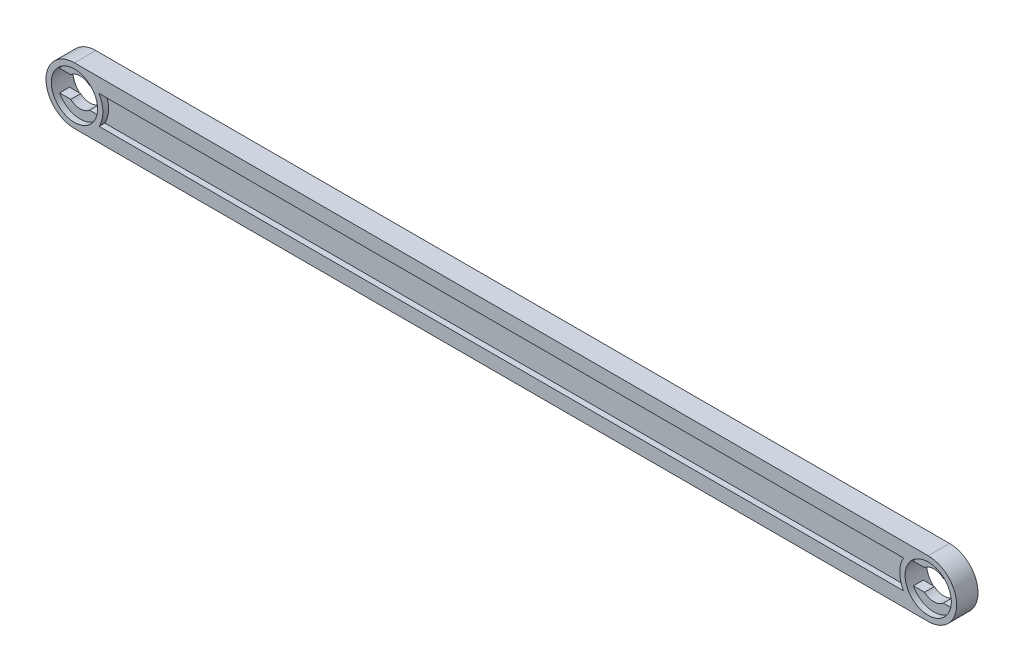
ISO-10303-21;
HEADER;
FILE_DESCRIPTION(('STEP AP214'),'2;1');
FILE_NAME('part.step','',(''),(''),'','','');
FILE_SCHEMA(('AUTOMOTIVE_DESIGN { 1 0 10303 214 1 1 1 1 }'));
ENDSEC;
DATA;
#1=APPLICATION_CONTEXT('core data for automotive mechanical design processes');
#2=APPLICATION_PROTOCOL_DEFINITION('international standard','automotive_design',2000,#1);
#3=PRODUCT_CONTEXT('',#1,'mechanical');
#4=PRODUCT('Part','Part','',(#3));
#5=PRODUCT_RELATED_PRODUCT_CATEGORY('part','',(#4));
#6=PRODUCT_DEFINITION_FORMATION('','',#4);
#7=PRODUCT_DEFINITION_CONTEXT('part definition',#1,'design');
#8=PRODUCT_DEFINITION('design','',#6,#7);
#9=PRODUCT_DEFINITION_SHAPE('','',#8);
#10=(LENGTH_UNIT() NAMED_UNIT(*) SI_UNIT(.MILLI.,.METRE.));
#11=(NAMED_UNIT(*) PLANE_ANGLE_UNIT() SI_UNIT($,.RADIAN.));
#12=(NAMED_UNIT(*) SI_UNIT($,.STERADIAN.) SOLID_ANGLE_UNIT());
#13=UNCERTAINTY_MEASURE_WITH_UNIT(LENGTH_MEASURE(1.E-05),#10,'distance_accuracy_value','');
#14=(GEOMETRIC_REPRESENTATION_CONTEXT(3) GLOBAL_UNCERTAINTY_ASSIGNED_CONTEXT((#13)) GLOBAL_UNIT_ASSIGNED_CONTEXT((#10,
#11,#12)) REPRESENTATION_CONTEXT('',''));
#15=CARTESIAN_POINT('',(0.,0.,0.));
#16=DIRECTION('',(0.,0.,1.));
#17=DIRECTION('',(1.,0.,0.));
#18=AXIS2_PLACEMENT_3D('',#15,#16,#17);
#19=CARTESIAN_POINT('',(0.,0.,0.));
#20=DIRECTION('',(0.,0.,1.));
#21=DIRECTION('',(1.,0.,0.));
#22=AXIS2_PLACEMENT_3D('',#19,#20,#21);
#23=PLANE('',#22);
#24=CARTESIAN_POINT('',(120.,0.,0.));
#25=DIRECTION('',(0.,0.,-1.));
#26=DIRECTION('',(1.,0.,0.));
#27=AXIS2_PLACEMENT_3D('',#24,#25,#26);
#28=CIRCLE('',#27,4.);
#29=CARTESIAN_POINT('',(116.535898384862,-2.,0.));
#30=VERTEX_POINT('',#29);
#31=CARTESIAN_POINT('',(116.535898384862,2.,0.));
#32=VERTEX_POINT('',#31);
#33=EDGE_CURVE('E57',#30,#32,#28,.T.);
#34=ORIENTED_EDGE('',*,*,#33,.F.);
#35=DIRECTION('',(1.,0.,0.));
#36=VECTOR('',#35,1.);
#37=CARTESIAN_POINT('',(3.46410161513775,-2.,0.));
#38=LINE('',#37,#36);
#39=CARTESIAN_POINT('',(3.46410161513775,-2.,0.));
#40=VERTEX_POINT('',#39);
#41=EDGE_CURVE('E261',#40,#30,#38,.T.);
#42=ORIENTED_EDGE('',*,*,#41,.F.);
#43=CARTESIAN_POINT('',(0.,0.,0.));
#44=DIRECTION('',(0.,0.,-1.));
#45=DIRECTION('',(1.,0.,0.));
#46=AXIS2_PLACEMENT_3D('',#43,#44,#45);
#47=CIRCLE('',#46,4.);
#48=CARTESIAN_POINT('',(3.46410161513776,2.,0.));
#49=VERTEX_POINT('',#48);
#50=EDGE_CURVE('E275',#49,#40,#47,.T.);
#51=ORIENTED_EDGE('',*,*,#50,.F.);
#52=DIRECTION('',(-1.,0.,0.));
#53=VECTOR('',#52,1.);
#54=CARTESIAN_POINT('',(3.46410161513775,2.,0.));
#55=LINE('',#54,#53);
#56=EDGE_CURVE('E272',#32,#49,#55,.T.);
#57=ORIENTED_EDGE('',*,*,#56,.F.);
#58=EDGE_LOOP('',(#34,#42,#51,#57));
#59=FACE_BOUND('',#58,.T.);
#60=CARTESIAN_POINT('',(0.,0.,0.));
#61=DIRECTION('',(0.,0.,1.));
#62=DIRECTION('',(1.,0.,0.));
#63=AXIS2_PLACEMENT_3D('',#60,#61,#62);
#64=CIRCLE('',#63,4.);
#65=CARTESIAN_POINT('',(0.,4.,0.));
#66=VERTEX_POINT('',#65);
#67=CARTESIAN_POINT('',(0.,-4.,0.));
#68=VERTEX_POINT('',#67);
#69=EDGE_CURVE('E393',#66,#68,#64,.T.);
#70=ORIENTED_EDGE('',*,*,#69,.T.);
#71=DIRECTION('',(1.,0.,0.));
#72=VECTOR('',#71,1.);
#73=CARTESIAN_POINT('',(0.,-4.,0.));
#74=LINE('',#73,#72);
#75=CARTESIAN_POINT('',(120.,-4.,0.));
#76=VERTEX_POINT('',#75);
#77=EDGE_CURVE('E423',#68,#76,#74,.T.);
#78=ORIENTED_EDGE('',*,*,#77,.T.);
#79=CARTESIAN_POINT('',(120.,0.,0.));
#80=DIRECTION('',(0.,0.,1.));
#81=DIRECTION('',(1.,0.,0.));
#82=AXIS2_PLACEMENT_3D('',#79,#80,#81);
#83=CIRCLE('',#82,4.);
#84=CARTESIAN_POINT('',(120.,4.,0.));
#85=VERTEX_POINT('',#84);
#86=EDGE_CURVE('E426',#76,#85,#83,.T.);
#87=ORIENTED_EDGE('',*,*,#86,.T.);
#88=DIRECTION('',(-1.,0.,0.));
#89=VECTOR('',#88,1.);
#90=CARTESIAN_POINT('',(0.,4.,0.));
#91=LINE('',#90,#89);
#92=EDGE_CURVE('E411',#85,#66,#91,.T.);
#93=ORIENTED_EDGE('',*,*,#92,.T.);
#94=EDGE_LOOP('',(#70,#78,#87,#93));
#95=FACE_BOUND('',#94,.T.);
#96=CARTESIAN_POINT('',(0.,0.,0.));
#97=DIRECTION('',(0.,0.,1.));
#98=DIRECTION('',(1.,0.,0.));
#99=AXIS2_PLACEMENT_3D('',#96,#97,#98);
#100=CIRCLE('',#99,3.25);
#101=CARTESIAN_POINT('',(3.25,0.,0.));
#102=VERTEX_POINT('',#101);
#103=EDGE_CURVE('E387',#102,#102,#100,.T.);
#104=ORIENTED_EDGE('',*,*,#103,.F.);
#105=EDGE_LOOP('',(#104));
#106=FACE_BOUND('',#105,.T.);
#107=CARTESIAN_POINT('',(120.,0.,0.));
#108=DIRECTION('',(0.,0.,-1.));
#109=DIRECTION('',(-1.,0.,0.));
#110=AXIS2_PLACEMENT_3D('',#107,#108,#109);
#111=CIRCLE('',#110,3.25);
#112=CARTESIAN_POINT('',(116.75,0.,0.));
#113=VERTEX_POINT('',#112);
#114=EDGE_CURVE('E324',#113,#113,#111,.T.);
#115=ORIENTED_EDGE('',*,*,#114,.T.);
#116=EDGE_LOOP('',(#115));
#117=FACE_BOUND('',#116,.T.);
#118=ADVANCED_FACE('F34',(#59,#95,#106,#117),#23,.T.);
#119=CARTESIAN_POINT('',(122.883140648668,-1.5,-3.001));
#120=DIRECTION('',(0.,1.,0.));
#121=DIRECTION('',(0.,0.,1.));
#122=AXIS2_PLACEMENT_3D('',#119,#120,#121);
#123=PLANE('',#122);
#124=DIRECTION('',(1.,0.,0.));
#125=VECTOR('',#124,1.);
#126=CARTESIAN_POINT('',(122.883140648668,-1.5,-2.2));
#127=LINE('',#126,#125);
#128=CARTESIAN_POINT('',(121.322875655532,-1.5,-2.2));
#129=VERTEX_POINT('',#128);
#130=CARTESIAN_POINT('',(122.883140648668,-1.5,-2.2));
#131=VERTEX_POINT('',#130);
#132=EDGE_CURVE('E300',#129,#131,#127,.T.);
#133=ORIENTED_EDGE('',*,*,#132,.F.);
#134=DIRECTION('',(0.,0.,1.));
#135=VECTOR('',#134,1.);
#136=CARTESIAN_POINT('',(121.322875655532,-1.5,-3.001));
#137=LINE('',#136,#135);
#138=CARTESIAN_POINT('',(121.322875655532,-1.5,-0.8));
#139=VERTEX_POINT('',#138);
#140=EDGE_CURVE('E331',#129,#139,#137,.T.);
#141=ORIENTED_EDGE('',*,*,#140,.T.);
#142=DIRECTION('',(1.,0.,0.));
#143=VECTOR('',#142,1.);
#144=CARTESIAN_POINT('',(122.883140648668,-1.5,-0.8));
#145=LINE('',#144,#143);
#146=CARTESIAN_POINT('',(122.883140648668,-1.5,-0.8));
#147=VERTEX_POINT('',#146);
#148=EDGE_CURVE('E318',#139,#147,#145,.T.);
#149=ORIENTED_EDGE('',*,*,#148,.T.);
#150=DIRECTION('',(0.,0.,1.));
#151=VECTOR('',#150,1.);
#152=CARTESIAN_POINT('',(122.883140648668,-1.5,-3.001));
#153=LINE('',#152,#151);
#154=EDGE_CURVE('E328',#131,#147,#153,.T.);
#155=ORIENTED_EDGE('',*,*,#154,.F.);
#156=EDGE_LOOP('',(#133,#141,#149,#155));
#157=FACE_BOUND('',#156,.T.);
#158=ADVANCED_FACE('F476',(#157),#123,.T.);
#159=CARTESIAN_POINT('',(120.,0.,-3.001));
#160=DIRECTION('',(0.,0.,1.));
#161=DIRECTION('',(1.,0.,0.));
#162=AXIS2_PLACEMENT_3D('',#159,#160,#161);
#163=CYLINDRICAL_SURFACE('',#162,2.);
#164=CARTESIAN_POINT('',(120.,0.,-2.2));
#165=DIRECTION('',(0.,0.,1.));
#166=DIRECTION('',(1.,0.,0.));
#167=AXIS2_PLACEMENT_3D('',#164,#165,#166);
#168=CIRCLE('',#167,2.);
#169=CARTESIAN_POINT('',(118.677124344468,-1.5,-2.2));
#170=VERTEX_POINT('',#169);
#171=EDGE_CURVE('E298',#170,#129,#168,.T.);
#172=ORIENTED_EDGE('',*,*,#171,.F.);
#173=DIRECTION('',(0.,0.,1.));
#174=VECTOR('',#173,1.);
#175=CARTESIAN_POINT('',(118.677124344468,-1.5,-3.001));
#176=LINE('',#175,#174);
#177=CARTESIAN_POINT('',(118.677124344468,-1.5,-0.800000000000001));
#178=VERTEX_POINT('',#177);
#179=EDGE_CURVE('E333',#170,#178,#176,.T.);
#180=ORIENTED_EDGE('',*,*,#179,.T.);
#181=CARTESIAN_POINT('',(120.,0.,-0.8));
#182=DIRECTION('',(0.,0.,1.));
#183=DIRECTION('',(1.,0.,0.));
#184=AXIS2_PLACEMENT_3D('',#181,#182,#183);
#185=CIRCLE('',#184,2.);
#186=EDGE_CURVE('E315',#178,#139,#185,.T.);
#187=ORIENTED_EDGE('',*,*,#186,.T.);
#188=ORIENTED_EDGE('',*,*,#140,.F.);
#189=EDGE_LOOP('',(#172,#180,#187,#188));
#190=FACE_BOUND('',#189,.T.);
#191=ADVANCED_FACE('F482',(#190),#163,.F.);
#192=CARTESIAN_POINT('',(118.677124344468,-1.5,-3.001));
#193=DIRECTION('',(0.,1.,0.));
#194=DIRECTION('',(0.,0.,1.));
#195=AXIS2_PLACEMENT_3D('',#192,#193,#194);
#196=PLANE('',#195);
#197=DIRECTION('',(1.,0.,0.));
#198=VECTOR('',#197,1.);
#199=CARTESIAN_POINT('',(118.677124344468,-1.5,-2.2));
#200=LINE('',#199,#198);
#201=CARTESIAN_POINT('',(117.116859351332,-1.5,-2.2));
#202=VERTEX_POINT('',#201);
#203=EDGE_CURVE('E296',#202,#170,#200,.T.);
#204=ORIENTED_EDGE('',*,*,#203,.F.);
#205=DIRECTION('',(0.,0.,1.));
#206=VECTOR('',#205,1.);
#207=CARTESIAN_POINT('',(117.116859351332,-1.5,-3.001));
#208=LINE('',#207,#206);
#209=CARTESIAN_POINT('',(117.116859351332,-1.5,-0.8));
#210=VERTEX_POINT('',#209);
#211=EDGE_CURVE('E335',#202,#210,#208,.T.);
#212=ORIENTED_EDGE('',*,*,#211,.T.);
#213=DIRECTION('',(1.,0.,0.));
#214=VECTOR('',#213,1.);
#215=CARTESIAN_POINT('',(118.677124344468,-1.5,-0.8));
#216=LINE('',#215,#214);
#217=EDGE_CURVE('E312',#210,#178,#216,.T.);
#218=ORIENTED_EDGE('',*,*,#217,.T.);
#219=ORIENTED_EDGE('',*,*,#179,.F.);
#220=EDGE_LOOP('',(#204,#212,#218,#219));
#221=FACE_BOUND('',#220,.T.);
#222=ADVANCED_FACE('F586',(#221),#196,.T.);
#223=CARTESIAN_POINT('',(118.677124344468,1.5,-3.001));
#224=DIRECTION('',(0.,-1.,0.));
#225=DIRECTION('',(0.,0.,-1.));
#226=AXIS2_PLACEMENT_3D('',#223,#224,#225);
#227=PLANE('',#226);
#228=DIRECTION('',(-1.,0.,0.));
#229=VECTOR('',#228,1.);
#230=CARTESIAN_POINT('',(118.677124344468,1.5,-2.2));
#231=LINE('',#230,#229);
#232=CARTESIAN_POINT('',(118.677124344468,1.5,-2.2));
#233=VERTEX_POINT('',#232);
#234=CARTESIAN_POINT('',(117.116859351332,1.5,-2.2));
#235=VERTEX_POINT('',#234);
#236=EDGE_CURVE('E294',#233,#235,#231,.T.);
#237=ORIENTED_EDGE('',*,*,#236,.F.);
#238=DIRECTION('',(0.,0.,1.));
#239=VECTOR('',#238,1.);
#240=CARTESIAN_POINT('',(118.677124344468,1.5,-3.001));
#241=LINE('',#240,#239);
#242=CARTESIAN_POINT('',(118.677124344468,1.5,-0.8));
#243=VERTEX_POINT('',#242);
#244=EDGE_CURVE('E339',#233,#243,#241,.T.);
#245=ORIENTED_EDGE('',*,*,#244,.T.);
#246=DIRECTION('',(-1.,0.,0.));
#247=VECTOR('',#246,1.);
#248=CARTESIAN_POINT('',(118.677124344468,1.5,-0.8));
#249=LINE('',#248,#247);
#250=CARTESIAN_POINT('',(117.116859351332,1.5,-0.8));
#251=VERTEX_POINT('',#250);
#252=EDGE_CURVE('E309',#243,#251,#249,.T.);
#253=ORIENTED_EDGE('',*,*,#252,.T.);
#254=DIRECTION('',(0.,0.,1.));
#255=VECTOR('',#254,1.);
#256=CARTESIAN_POINT('',(117.116859351332,1.5,-3.001));
#257=LINE('',#256,#255);
#258=EDGE_CURVE('E337',#235,#251,#257,.T.);
#259=ORIENTED_EDGE('',*,*,#258,.F.);
#260=EDGE_LOOP('',(#237,#245,#253,#259));
#261=FACE_BOUND('',#260,.T.);
#262=ADVANCED_FACE('F590',(#261),#227,.T.);
#263=CARTESIAN_POINT('',(120.,0.,-3.001));
#264=DIRECTION('',(0.,0.,1.));
#265=DIRECTION('',(1.,0.,0.));
#266=AXIS2_PLACEMENT_3D('',#263,#264,#265);
#267=CYLINDRICAL_SURFACE('',#266,2.);
#268=CARTESIAN_POINT('',(120.,0.,-2.2));
#269=DIRECTION('',(0.,0.,1.));
#270=DIRECTION('',(1.,0.,0.));
#271=AXIS2_PLACEMENT_3D('',#268,#269,#270);
#272=CIRCLE('',#271,2.);
#273=CARTESIAN_POINT('',(121.322875655532,1.5,-2.2));
#274=VERTEX_POINT('',#273);
#275=EDGE_CURVE('E292',#274,#233,#272,.T.);
#276=ORIENTED_EDGE('',*,*,#275,.F.);
#277=DIRECTION('',(0.,0.,1.));
#278=VECTOR('',#277,1.);
#279=CARTESIAN_POINT('',(121.322875655532,1.5,-3.001));
#280=LINE('',#279,#278);
#281=CARTESIAN_POINT('',(121.322875655532,1.5,-0.800000000000001));
#282=VERTEX_POINT('',#281);
#283=EDGE_CURVE('E341',#274,#282,#280,.T.);
#284=ORIENTED_EDGE('',*,*,#283,.T.);
#285=CARTESIAN_POINT('',(120.,0.,-0.8));
#286=DIRECTION('',(0.,0.,1.));
#287=DIRECTION('',(1.,0.,0.));
#288=AXIS2_PLACEMENT_3D('',#285,#286,#287);
#289=CIRCLE('',#288,2.);
#290=EDGE_CURVE('E306',#282,#243,#289,.T.);
#291=ORIENTED_EDGE('',*,*,#290,.T.);
#292=ORIENTED_EDGE('',*,*,#244,.F.);
#293=EDGE_LOOP('',(#276,#284,#291,#292));
#294=FACE_BOUND('',#293,.T.);
#295=ADVANCED_FACE('F532',(#294),#267,.F.);
#296=CARTESIAN_POINT('',(122.883140648668,1.5,-3.001));
#297=DIRECTION('',(0.,-1.,0.));
#298=DIRECTION('',(0.,0.,-1.));
#299=AXIS2_PLACEMENT_3D('',#296,#297,#298);
#300=PLANE('',#299);
#301=DIRECTION('',(-1.,0.,0.));
#302=VECTOR('',#301,1.);
#303=CARTESIAN_POINT('',(122.883140648668,1.5,-2.2));
#304=LINE('',#303,#302);
#305=CARTESIAN_POINT('',(122.883140648668,1.5,-2.2));
#306=VERTEX_POINT('',#305);
#307=EDGE_CURVE('E290',#306,#274,#304,.T.);
#308=ORIENTED_EDGE('',*,*,#307,.F.);
#309=DIRECTION('',(0.,0.,1.));
#310=VECTOR('',#309,1.);
#311=CARTESIAN_POINT('',(122.883140648668,1.5,-3.001));
#312=LINE('',#311,#310);
#313=CARTESIAN_POINT('',(122.883140648668,1.5,-0.8));
#314=VERTEX_POINT('',#313);
#315=EDGE_CURVE('E327',#306,#314,#312,.T.);
#316=ORIENTED_EDGE('',*,*,#315,.T.);
#317=DIRECTION('',(-1.,0.,0.));
#318=VECTOR('',#317,1.);
#319=CARTESIAN_POINT('',(122.883140648668,1.5,-0.8));
#320=LINE('',#319,#318);
#321=EDGE_CURVE('E11',#314,#282,#320,.T.);
#322=ORIENTED_EDGE('',*,*,#321,.T.);
#323=ORIENTED_EDGE('',*,*,#283,.F.);
#324=EDGE_LOOP('',(#308,#316,#322,#323));
#325=FACE_BOUND('',#324,.T.);
#326=ADVANCED_FACE('F518',(#325),#300,.T.);
#327=CARTESIAN_POINT('',(0.,0.,-3.));
#328=DIRECTION('',(0.,0.,1.));
#329=DIRECTION('',(1.,0.,0.));
#330=AXIS2_PLACEMENT_3D('',#327,#328,#329);
#331=PLANE('',#330);
#332=DIRECTION('',(-1.,0.,0.));
#333=VECTOR('',#332,1.);
#334=CARTESIAN_POINT('',(116.,-2.,-3.));
#335=LINE('',#334,#333);
#336=CARTESIAN_POINT('',(116.,-2.,-3.));
#337=VERTEX_POINT('',#336);
#338=CARTESIAN_POINT('',(4.,-2.,-3.));
#339=VERTEX_POINT('',#338);
#340=EDGE_CURVE('E248',#337,#339,#335,.T.);
#341=ORIENTED_EDGE('',*,*,#340,.F.);
#342=DIRECTION('',(0.,-1.,0.));
#343=VECTOR('',#342,1.);
#344=CARTESIAN_POINT('',(116.,-2.,-3.));
#345=LINE('',#344,#343);
#346=CARTESIAN_POINT('',(116.,2.,-3.));
#347=VERTEX_POINT('',#346);
#348=EDGE_CURVE('E49',#347,#337,#345,.T.);
#349=ORIENTED_EDGE('',*,*,#348,.F.);
#350=DIRECTION('',(1.,0.,0.));
#351=VECTOR('',#350,1.);
#352=CARTESIAN_POINT('',(116.,2.,-3.));
#353=LINE('',#352,#351);
#354=CARTESIAN_POINT('',(4.,2.,-3.));
#355=VERTEX_POINT('',#354);
#356=EDGE_CURVE('E239',#355,#347,#353,.T.);
#357=ORIENTED_EDGE('',*,*,#356,.F.);
#358=DIRECTION('',(0.,1.,0.));
#359=VECTOR('',#358,1.);
#360=CARTESIAN_POINT('',(4.,-2.,-3.));
#361=LINE('',#360,#359);
#362=EDGE_CURVE('E242',#339,#355,#361,.T.);
#363=ORIENTED_EDGE('',*,*,#362,.F.);
#364=EDGE_LOOP('',(#341,#349,#357,#363));
#365=FACE_BOUND('',#364,.T.);
#366=CARTESIAN_POINT('',(0.,0.,-3.));
#367=DIRECTION('',(0.,0.,1.));
#368=DIRECTION('',(1.,0.,0.));
#369=AXIS2_PLACEMENT_3D('',#366,#367,#368);
#370=CIRCLE('',#369,3.25);
#371=CARTESIAN_POINT('',(3.25,0.,-3.));
#372=VERTEX_POINT('',#371);
#373=EDGE_CURVE('E384',#372,#372,#370,.F.);
#374=ORIENTED_EDGE('',*,*,#373,.F.);
#375=EDGE_LOOP('',(#374));
#376=FACE_BOUND('',#375,.T.);
#377=CARTESIAN_POINT('',(0.,0.,-3.));
#378=DIRECTION('',(0.,0.,1.));
#379=DIRECTION('',(1.,0.,0.));
#380=AXIS2_PLACEMENT_3D('',#377,#378,#379);
#381=CIRCLE('',#380,4.);
#382=CARTESIAN_POINT('',(0.,4.,-3.));
#383=VERTEX_POINT('',#382);
#384=CARTESIAN_POINT('',(0.,-4.,-3.));
#385=VERTEX_POINT('',#384);
#386=EDGE_CURVE('E407',#383,#385,#381,.T.);
#387=ORIENTED_EDGE('',*,*,#386,.F.);
#388=DIRECTION('',(-1.,0.,0.));
#389=VECTOR('',#388,1.);
#390=CARTESIAN_POINT('',(0.,4.,-3.));
#391=LINE('',#390,#389);
#392=CARTESIAN_POINT('',(120.,4.,-3.));
#393=VERTEX_POINT('',#392);
#394=EDGE_CURVE('E417',#393,#383,#391,.T.);
#395=ORIENTED_EDGE('',*,*,#394,.F.);
#396=CARTESIAN_POINT('',(120.,0.,-3.));
#397=DIRECTION('',(0.,0.,1.));
#398=DIRECTION('',(1.,0.,0.));
#399=AXIS2_PLACEMENT_3D('',#396,#397,#398);
#400=CIRCLE('',#399,4.);
#401=CARTESIAN_POINT('',(120.,-4.,-3.));
#402=VERTEX_POINT('',#401);
#403=EDGE_CURVE('E414',#402,#393,#400,.T.);
#404=ORIENTED_EDGE('',*,*,#403,.F.);
#405=DIRECTION('',(1.,0.,0.));
#406=VECTOR('',#405,1.);
#407=CARTESIAN_POINT('',(0.,-4.,-3.));
#408=LINE('',#407,#406);
#409=EDGE_CURVE('E410',#385,#402,#408,.T.);
#410=ORIENTED_EDGE('',*,*,#409,.F.);
#411=EDGE_LOOP('',(#387,#395,#404,#410));
#412=FACE_BOUND('',#411,.T.);
#413=CARTESIAN_POINT('',(120.,0.,-3.));
#414=DIRECTION('',(0.,0.,1.));
#415=DIRECTION('',(1.,0.,0.));
#416=AXIS2_PLACEMENT_3D('',#413,#414,#415);
#417=CIRCLE('',#416,3.25);
#418=CARTESIAN_POINT('',(123.25,0.,-3.));
#419=VERTEX_POINT('',#418);
#420=EDGE_CURVE('E321',#419,#419,#417,.T.);
#421=ORIENTED_EDGE('',*,*,#420,.T.);
#422=EDGE_LOOP('',(#421));
#423=FACE_BOUND('',#422,.T.);
#424=ADVANCED_FACE('F488',(#365,#376,#412,#423),#331,.F.);
#425=CARTESIAN_POINT('',(-2.8831406486677,1.5,-3.001));
#426=DIRECTION('',(0.,1.,0.));
#427=DIRECTION('',(0.,0.,1.));
#428=AXIS2_PLACEMENT_3D('',#425,#426,#427);
#429=PLANE('',#428);
#430=DIRECTION('',(0.,0.,1.));
#431=VECTOR('',#430,1.);
#432=CARTESIAN_POINT('',(-2.8831406486677,1.5,-3.001));
#433=LINE('',#432,#431);
#434=CARTESIAN_POINT('',(-2.8831406486677,1.5,-2.2));
#435=VERTEX_POINT('',#434);
#436=CARTESIAN_POINT('',(-2.8831406486677,1.5,-0.8));
#437=VERTEX_POINT('',#436);
#438=EDGE_CURVE('E391',#435,#437,#433,.T.);
#439=ORIENTED_EDGE('',*,*,#438,.F.);
#440=DIRECTION('',(1.,0.,0.));
#441=VECTOR('',#440,1.);
#442=CARTESIAN_POINT('',(-2.8831406486677,1.5,-2.2));
#443=LINE('',#442,#441);
#444=CARTESIAN_POINT('',(-1.3228756555323,1.5,-2.2));
#445=VERTEX_POINT('',#444);
#446=EDGE_CURVE('E362',#435,#445,#443,.T.);
#447=ORIENTED_EDGE('',*,*,#446,.T.);
#448=DIRECTION('',(0.,0.,1.));
#449=VECTOR('',#448,1.);
#450=CARTESIAN_POINT('',(-1.3228756555323,1.5,-3.001));
#451=LINE('',#450,#449);
#452=CARTESIAN_POINT('',(-1.3228756555323,1.5,-0.8));
#453=VERTEX_POINT('',#452);
#454=EDGE_CURVE('E394',#445,#453,#451,.T.);
#455=ORIENTED_EDGE('',*,*,#454,.T.);
#456=DIRECTION('',(1.,0.,0.));
#457=VECTOR('',#456,1.);
#458=CARTESIAN_POINT('',(-2.8831406486677,1.5,-0.8));
#459=LINE('',#458,#457);
#460=EDGE_CURVE('E381',#437,#453,#459,.T.);
#461=ORIENTED_EDGE('',*,*,#460,.F.);
#462=EDGE_LOOP('',(#439,#447,#455,#461));
#463=FACE_BOUND('',#462,.T.);
#464=ADVANCED_FACE('F517',(#463),#429,.F.);
#465=CARTESIAN_POINT('',(0.,0.,-3.001));
#466=DIRECTION('',(0.,0.,1.));
#467=DIRECTION('',(1.,0.,0.));
#468=AXIS2_PLACEMENT_3D('',#465,#466,#467);
#469=CYLINDRICAL_SURFACE('',#468,2.);
#470=ORIENTED_EDGE('',*,*,#454,.F.);
#471=CARTESIAN_POINT('',(0.,0.,-2.2));
#472=DIRECTION('',(0.,0.,1.));
#473=DIRECTION('',(1.,0.,0.));
#474=AXIS2_PLACEMENT_3D('',#471,#472,#473);
#475=CIRCLE('',#474,2.);
#476=CARTESIAN_POINT('',(1.3228756555323,1.5,-2.2));
#477=VERTEX_POINT('',#476);
#478=EDGE_CURVE('E359',#445,#477,#475,.F.);
#479=ORIENTED_EDGE('',*,*,#478,.T.);
#480=DIRECTION('',(0.,0.,1.));
#481=VECTOR('',#480,1.);
#482=CARTESIAN_POINT('',(1.3228756555323,1.5,-3.001));
#483=LINE('',#482,#481);
#484=CARTESIAN_POINT('',(1.3228756555323,1.5,-0.800000000000001));
#485=VERTEX_POINT('',#484);
#486=EDGE_CURVE('E396',#477,#485,#483,.T.);
#487=ORIENTED_EDGE('',*,*,#486,.T.);
#488=CARTESIAN_POINT('',(0.,0.,-0.8));
#489=DIRECTION('',(0.,0.,1.));
#490=DIRECTION('',(1.,0.,0.));
#491=AXIS2_PLACEMENT_3D('',#488,#489,#490);
#492=CIRCLE('',#491,2.);
#493=EDGE_CURVE('E378',#453,#485,#492,.F.);
#494=ORIENTED_EDGE('',*,*,#493,.F.);
#495=EDGE_LOOP('',(#470,#479,#487,#494));
#496=FACE_BOUND('',#495,.T.);
#497=ADVANCED_FACE('F529',(#496),#469,.F.);
#498=CARTESIAN_POINT('',(1.3228756555323,1.5,-3.001));
#499=DIRECTION('',(0.,1.,0.));
#500=DIRECTION('',(0.,0.,1.));
#501=AXIS2_PLACEMENT_3D('',#498,#499,#500);
#502=PLANE('',#501);
#503=ORIENTED_EDGE('',*,*,#486,.F.);
#504=DIRECTION('',(1.,0.,0.));
#505=VECTOR('',#504,1.);
#506=CARTESIAN_POINT('',(1.3228756555323,1.5,-2.2));
#507=LINE('',#506,#505);
#508=CARTESIAN_POINT('',(2.8831406486677,1.5,-2.2));
#509=VERTEX_POINT('',#508);
#510=EDGE_CURVE('E356',#477,#509,#507,.T.);
#511=ORIENTED_EDGE('',*,*,#510,.T.);
#512=DIRECTION('',(0.,0.,1.));
#513=VECTOR('',#512,1.);
#514=CARTESIAN_POINT('',(2.8831406486677,1.5,-3.001));
#515=LINE('',#514,#513);
#516=CARTESIAN_POINT('',(2.8831406486677,1.5,-0.8));
#517=VERTEX_POINT('',#516);
#518=EDGE_CURVE('E398',#509,#517,#515,.T.);
#519=ORIENTED_EDGE('',*,*,#518,.T.);
#520=DIRECTION('',(1.,0.,0.));
#521=VECTOR('',#520,1.);
#522=CARTESIAN_POINT('',(1.3228756555323,1.5,-0.8));
#523=LINE('',#522,#521);
#524=EDGE_CURVE('E375',#485,#517,#523,.T.);
#525=ORIENTED_EDGE('',*,*,#524,.F.);
#526=EDGE_LOOP('',(#503,#511,#519,#525));
#527=FACE_BOUND('',#526,.T.);
#528=ADVANCED_FACE('F807',(#527),#502,.F.);
#529=CARTESIAN_POINT('',(1.3228756555323,-1.5,-3.001));
#530=DIRECTION('',(0.,-1.,0.));
#531=DIRECTION('',(0.,0.,-1.));
#532=AXIS2_PLACEMENT_3D('',#529,#530,#531);
#533=PLANE('',#532);
#534=DIRECTION('',(0.,0.,1.));
#535=VECTOR('',#534,1.);
#536=CARTESIAN_POINT('',(2.8831406486677,-1.5,-3.001));
#537=LINE('',#536,#535);
#538=CARTESIAN_POINT('',(2.8831406486677,-1.5,-2.2));
#539=VERTEX_POINT('',#538);
#540=CARTESIAN_POINT('',(2.8831406486677,-1.5,-0.8));
#541=VERTEX_POINT('',#540);
#542=EDGE_CURVE('E400',#539,#541,#537,.T.);
#543=ORIENTED_EDGE('',*,*,#542,.F.);
#544=DIRECTION('',(-1.,0.,0.));
#545=VECTOR('',#544,1.);
#546=CARTESIAN_POINT('',(1.3228756555323,-1.5,-2.2));
#547=LINE('',#546,#545);
#548=CARTESIAN_POINT('',(1.32287565553229,-1.5,-2.2));
#549=VERTEX_POINT('',#548);
#550=EDGE_CURVE('E353',#539,#549,#547,.T.);
#551=ORIENTED_EDGE('',*,*,#550,.T.);
#552=DIRECTION('',(0.,0.,1.));
#553=VECTOR('',#552,1.);
#554=CARTESIAN_POINT('',(1.32287565553229,-1.5,-3.001));
#555=LINE('',#554,#553);
#556=CARTESIAN_POINT('',(1.32287565553229,-1.5,-0.8));
#557=VERTEX_POINT('',#556);
#558=EDGE_CURVE('E402',#549,#557,#555,.T.);
#559=ORIENTED_EDGE('',*,*,#558,.T.);
#560=DIRECTION('',(-1.,0.,0.));
#561=VECTOR('',#560,1.);
#562=CARTESIAN_POINT('',(1.3228756555323,-1.5,-0.8));
#563=LINE('',#562,#561);
#564=EDGE_CURVE('E372',#541,#557,#563,.T.);
#565=ORIENTED_EDGE('',*,*,#564,.F.);
#566=EDGE_LOOP('',(#543,#551,#559,#565));
#567=FACE_BOUND('',#566,.T.);
#568=ADVANCED_FACE('F454',(#567),#533,.F.);
#569=CARTESIAN_POINT('',(0.,0.,-3.001));
#570=DIRECTION('',(0.,0.,1.));
#571=DIRECTION('',(1.,0.,0.));
#572=AXIS2_PLACEMENT_3D('',#569,#570,#571);
#573=CYLINDRICAL_SURFACE('',#572,2.);
#574=ORIENTED_EDGE('',*,*,#558,.F.);
#575=CARTESIAN_POINT('',(0.,0.,-2.2));
#576=DIRECTION('',(0.,0.,1.));
#577=DIRECTION('',(1.,0.,0.));
#578=AXIS2_PLACEMENT_3D('',#575,#576,#577);
#579=CIRCLE('',#578,2.);
#580=CARTESIAN_POINT('',(-1.3228756555323,-1.5,-2.2));
#581=VERTEX_POINT('',#580);
#582=EDGE_CURVE('E350',#549,#581,#579,.F.);
#583=ORIENTED_EDGE('',*,*,#582,.T.);
#584=DIRECTION('',(0.,0.,1.));
#585=VECTOR('',#584,1.);
#586=CARTESIAN_POINT('',(-1.3228756555323,-1.5,-3.001));
#587=LINE('',#586,#585);
#588=CARTESIAN_POINT('',(-1.3228756555323,-1.5,-0.800000000000001));
#589=VERTEX_POINT('',#588);
#590=EDGE_CURVE('E404',#581,#589,#587,.T.);
#591=ORIENTED_EDGE('',*,*,#590,.T.);
#592=CARTESIAN_POINT('',(0.,0.,-0.8));
#593=DIRECTION('',(0.,0.,1.));
#594=DIRECTION('',(1.,0.,0.));
#595=AXIS2_PLACEMENT_3D('',#592,#593,#594);
#596=CIRCLE('',#595,2.);
#597=EDGE_CURVE('E369',#557,#589,#596,.F.);
#598=ORIENTED_EDGE('',*,*,#597,.F.);
#599=EDGE_LOOP('',(#574,#583,#591,#598));
#600=FACE_BOUND('',#599,.T.);
#601=ADVANCED_FACE('F457',(#600),#573,.F.);
#602=CARTESIAN_POINT('',(-2.8831406486677,-1.5,-3.001));
#603=DIRECTION('',(0.,-1.,0.));
#604=DIRECTION('',(0.,0.,-1.));
#605=AXIS2_PLACEMENT_3D('',#602,#603,#604);
#606=PLANE('',#605);
#607=ORIENTED_EDGE('',*,*,#590,.F.);
#608=DIRECTION('',(-1.,0.,0.));
#609=VECTOR('',#608,1.);
#610=CARTESIAN_POINT('',(-2.8831406486677,-1.5,-2.2));
#611=LINE('',#610,#609);
#612=CARTESIAN_POINT('',(-2.8831406486677,-1.5,-2.2));
#613=VERTEX_POINT('',#612);
#614=EDGE_CURVE('E347',#581,#613,#611,.T.);
#615=ORIENTED_EDGE('',*,*,#614,.T.);
#616=DIRECTION('',(0.,0.,1.));
#617=VECTOR('',#616,1.);
#618=CARTESIAN_POINT('',(-2.8831406486677,-1.5,-3.001));
#619=LINE('',#618,#617);
#620=CARTESIAN_POINT('',(-2.8831406486677,-1.5,-0.8));
#621=VERTEX_POINT('',#620);
#622=EDGE_CURVE('E390',#613,#621,#619,.T.);
#623=ORIENTED_EDGE('',*,*,#622,.T.);
#624=DIRECTION('',(-1.,0.,0.));
#625=VECTOR('',#624,1.);
#626=CARTESIAN_POINT('',(-2.8831406486677,-1.5,-0.8));
#627=LINE('',#626,#625);
#628=EDGE_CURVE('E42',#589,#621,#627,.T.);
#629=ORIENTED_EDGE('',*,*,#628,.F.);
#630=EDGE_LOOP('',(#607,#615,#623,#629));
#631=FACE_BOUND('',#630,.T.);
#632=ADVANCED_FACE('F458',(#631),#606,.F.);
#633=CARTESIAN_POINT('',(0.,0.,-3.));
#634=DIRECTION('',(0.,0.,1.));
#635=DIRECTION('',(1.,0.,0.));
#636=AXIS2_PLACEMENT_3D('',#633,#634,#635);
#637=CYLINDRICAL_SURFACE('',#636,4.);
#638=ORIENTED_EDGE('',*,*,#69,.F.);
#639=DIRECTION('',(0.,0.,1.));
#640=VECTOR('',#639,1.);
#641=CARTESIAN_POINT('',(0.,4.,-3.));
#642=LINE('',#641,#640);
#643=EDGE_CURVE('E431',#383,#66,#642,.T.);
#644=ORIENTED_EDGE('',*,*,#643,.F.);
#645=ORIENTED_EDGE('',*,*,#386,.T.);
#646=DIRECTION('',(0.,0.,1.));
#647=VECTOR('',#646,1.);
#648=CARTESIAN_POINT('',(0.,-4.,-3.));
#649=LINE('',#648,#647);
#650=EDGE_CURVE('E420',#385,#68,#649,.T.);
#651=ORIENTED_EDGE('',*,*,#650,.T.);
#652=EDGE_LOOP('',(#638,#644,#645,#651));
#653=FACE_BOUND('',#652,.T.);
#654=ADVANCED_FACE('F36',(#653),#637,.T.);
#655=CARTESIAN_POINT('',(0.,4.,-3.));
#656=DIRECTION('',(0.,1.,0.));
#657=DIRECTION('',(0.,0.,1.));
#658=AXIS2_PLACEMENT_3D('',#655,#656,#657);
#659=PLANE('',#658);
#660=ORIENTED_EDGE('',*,*,#92,.F.);
#661=DIRECTION('',(0.,0.,1.));
#662=VECTOR('',#661,1.);
#663=CARTESIAN_POINT('',(120.,4.,-3.));
#664=LINE('',#663,#662);
#665=EDGE_CURVE('E433',#393,#85,#664,.T.);
#666=ORIENTED_EDGE('',*,*,#665,.F.);
#667=ORIENTED_EDGE('',*,*,#394,.T.);
#668=ORIENTED_EDGE('',*,*,#643,.T.);
#669=EDGE_LOOP('',(#660,#666,#667,#668));
#670=FACE_BOUND('',#669,.T.);
#671=ADVANCED_FACE('F490',(#670),#659,.T.);
#672=CARTESIAN_POINT('',(120.,0.,-3.));
#673=DIRECTION('',(0.,0.,1.));
#674=DIRECTION('',(1.,0.,0.));
#675=AXIS2_PLACEMENT_3D('',#672,#673,#674);
#676=CYLINDRICAL_SURFACE('',#675,4.);
#677=ORIENTED_EDGE('',*,*,#86,.F.);
#678=DIRECTION('',(0.,0.,1.));
#679=VECTOR('',#678,1.);
#680=CARTESIAN_POINT('',(120.,-4.,-3.));
#681=LINE('',#680,#679);
#682=EDGE_CURVE('E435',#402,#76,#681,.T.);
#683=ORIENTED_EDGE('',*,*,#682,.F.);
#684=ORIENTED_EDGE('',*,*,#403,.T.);
#685=ORIENTED_EDGE('',*,*,#665,.T.);
#686=EDGE_LOOP('',(#677,#683,#684,#685));
#687=FACE_BOUND('',#686,.T.);
#688=ADVANCED_FACE('F493',(#687),#676,.T.);
#689=CARTESIAN_POINT('',(0.,-4.,-3.));
#690=DIRECTION('',(0.,-1.,0.));
#691=DIRECTION('',(1.,0.,0.));
#692=AXIS2_PLACEMENT_3D('',#689,#690,#691);
#693=PLANE('',#692);
#694=ORIENTED_EDGE('',*,*,#77,.F.);
#695=ORIENTED_EDGE('',*,*,#650,.F.);
#696=ORIENTED_EDGE('',*,*,#409,.T.);
#697=ORIENTED_EDGE('',*,*,#682,.T.);
#698=EDGE_LOOP('',(#694,#695,#696,#697));
#699=FACE_BOUND('',#698,.T.);
#700=ADVANCED_FACE('F496',(#699),#693,.T.);
#701=CARTESIAN_POINT('',(0.,0.,-3.001));
#702=DIRECTION('',(0.,0.,1.));
#703=DIRECTION('',(1.,0.,0.));
#704=AXIS2_PLACEMENT_3D('',#701,#702,#703);
#705=CYLINDRICAL_SURFACE('',#704,3.25);
#706=CARTESIAN_POINT('',(0.,0.,-2.2));
#707=DIRECTION('',(0.,0.,1.));
#708=DIRECTION('',(1.,0.,0.));
#709=AXIS2_PLACEMENT_3D('',#706,#707,#708);
#710=CIRCLE('',#709,3.25);
#711=EDGE_CURVE('E344',#509,#435,#710,.T.);
#712=ORIENTED_EDGE('',*,*,#711,.T.);
#713=ORIENTED_EDGE('',*,*,#438,.T.);
#714=CARTESIAN_POINT('',(0.,0.,-0.8));
#715=DIRECTION('',(0.,0.,1.));
#716=DIRECTION('',(1.,0.,0.));
#717=AXIS2_PLACEMENT_3D('',#714,#715,#716);
#718=CIRCLE('',#717,3.25);
#719=EDGE_CURVE('E366',#517,#437,#718,.T.);
#720=ORIENTED_EDGE('',*,*,#719,.F.);
#721=ORIENTED_EDGE('',*,*,#518,.F.);
#722=EDGE_LOOP('',(#712,#713,#720,#721));
#723=FACE_BOUND('',#722,.T.);
#724=EDGE_CURVE('E330',#613,#539,#710,.T.);
#725=ORIENTED_EDGE('',*,*,#724,.T.);
#726=ORIENTED_EDGE('',*,*,#542,.T.);
#727=EDGE_CURVE('E365',#621,#541,#718,.T.);
#728=ORIENTED_EDGE('',*,*,#727,.F.);
#729=ORIENTED_EDGE('',*,*,#622,.F.);
#730=EDGE_LOOP('',(#725,#726,#728,#729));
#731=FACE_BOUND('',#730,.T.);
#732=ORIENTED_EDGE('',*,*,#103,.T.);
#733=EDGE_LOOP('',(#732));
#734=FACE_BOUND('',#733,.T.);
#735=ORIENTED_EDGE('',*,*,#373,.T.);
#736=EDGE_LOOP('',(#735));
#737=FACE_BOUND('',#736,.T.);
#738=ADVANCED_FACE('F450',(#723,#731,#734,#737),#705,.F.);
#739=CARTESIAN_POINT('',(0.,0.,-0.8));
#740=DIRECTION('',(0.,0.,1.));
#741=DIRECTION('',(1.,0.,0.));
#742=AXIS2_PLACEMENT_3D('',#739,#740,#741);
#743=PLANE('',#742);
#744=ORIENTED_EDGE('',*,*,#564,.T.);
#745=ORIENTED_EDGE('',*,*,#597,.T.);
#746=ORIENTED_EDGE('',*,*,#628,.T.);
#747=ORIENTED_EDGE('',*,*,#727,.T.);
#748=EDGE_LOOP('',(#744,#745,#746,#747));
#749=FACE_BOUND('',#748,.T.);
#750=ADVANCED_FACE('F442',(#749),#743,.T.);
#751=ORIENTED_EDGE('',*,*,#460,.T.);
#752=ORIENTED_EDGE('',*,*,#493,.T.);
#753=ORIENTED_EDGE('',*,*,#524,.T.);
#754=ORIENTED_EDGE('',*,*,#719,.T.);
#755=EDGE_LOOP('',(#751,#752,#753,#754));
#756=FACE_BOUND('',#755,.T.);
#757=ADVANCED_FACE('F472',(#756),#743,.T.);
#758=CARTESIAN_POINT('',(0.,0.,-2.2));
#759=DIRECTION('',(0.,0.,1.));
#760=DIRECTION('',(1.,0.,0.));
#761=AXIS2_PLACEMENT_3D('',#758,#759,#760);
#762=PLANE('',#761);
#763=ORIENTED_EDGE('',*,*,#711,.F.);
#764=ORIENTED_EDGE('',*,*,#510,.F.);
#765=ORIENTED_EDGE('',*,*,#478,.F.);
#766=ORIENTED_EDGE('',*,*,#446,.F.);
#767=EDGE_LOOP('',(#763,#764,#765,#766));
#768=FACE_BOUND('',#767,.T.);
#769=ADVANCED_FACE('F463',(#768),#762,.F.);
#770=ORIENTED_EDGE('',*,*,#724,.F.);
#771=ORIENTED_EDGE('',*,*,#614,.F.);
#772=ORIENTED_EDGE('',*,*,#582,.F.);
#773=ORIENTED_EDGE('',*,*,#550,.F.);
#774=EDGE_LOOP('',(#770,#771,#772,#773));
#775=FACE_BOUND('',#774,.T.);
#776=ADVANCED_FACE('F460',(#775),#762,.F.);
#777=CARTESIAN_POINT('',(120.,0.,-3.001));
#778=DIRECTION('',(0.,0.,1.));
#779=DIRECTION('',(1.,0.,0.));
#780=AXIS2_PLACEMENT_3D('',#777,#778,#779);
#781=CYLINDRICAL_SURFACE('',#780,3.25);
#782=CARTESIAN_POINT('',(120.,0.,-2.2));
#783=DIRECTION('',(0.,0.,-1.));
#784=DIRECTION('',(-1.,0.,0.));
#785=AXIS2_PLACEMENT_3D('',#782,#783,#784);
#786=CIRCLE('',#785,3.25);
#787=EDGE_CURVE('E282',#131,#202,#786,.T.);
#788=ORIENTED_EDGE('',*,*,#787,.F.);
#789=ORIENTED_EDGE('',*,*,#154,.T.);
#790=CARTESIAN_POINT('',(120.,0.,-0.8));
#791=DIRECTION('',(0.,0.,-1.));
#792=DIRECTION('',(-1.,0.,0.));
#793=AXIS2_PLACEMENT_3D('',#790,#791,#792);
#794=CIRCLE('',#793,3.25);
#795=EDGE_CURVE('E302',#147,#210,#794,.T.);
#796=ORIENTED_EDGE('',*,*,#795,.T.);
#797=ORIENTED_EDGE('',*,*,#211,.F.);
#798=EDGE_LOOP('',(#788,#789,#796,#797));
#799=FACE_BOUND('',#798,.T.);
#800=EDGE_CURVE('E288',#235,#306,#786,.T.);
#801=ORIENTED_EDGE('',*,*,#800,.F.);
#802=ORIENTED_EDGE('',*,*,#258,.T.);
#803=EDGE_CURVE('E303',#251,#314,#794,.T.);
#804=ORIENTED_EDGE('',*,*,#803,.T.);
#805=ORIENTED_EDGE('',*,*,#315,.F.);
#806=EDGE_LOOP('',(#801,#802,#804,#805));
#807=FACE_BOUND('',#806,.T.);
#808=ORIENTED_EDGE('',*,*,#420,.F.);
#809=EDGE_LOOP('',(#808));
#810=FACE_BOUND('',#809,.T.);
#811=ORIENTED_EDGE('',*,*,#114,.F.);
#812=EDGE_LOOP('',(#811));
#813=FACE_BOUND('',#812,.T.);
#814=ADVANCED_FACE('F462',(#799,#807,#810,#813),#781,.F.);
#815=CARTESIAN_POINT('',(120.,0.,-0.8));
#816=DIRECTION('',(0.,0.,1.));
#817=DIRECTION('',(-1.,0.,0.));
#818=AXIS2_PLACEMENT_3D('',#815,#816,#817);
#819=PLANE('',#818);
#820=ORIENTED_EDGE('',*,*,#290,.F.);
#821=ORIENTED_EDGE('',*,*,#321,.F.);
#822=ORIENTED_EDGE('',*,*,#803,.F.);
#823=ORIENTED_EDGE('',*,*,#252,.F.);
#824=EDGE_LOOP('',(#820,#821,#822,#823));
#825=FACE_BOUND('',#824,.T.);
#826=ADVANCED_FACE('F469',(#825),#819,.T.);
#827=ORIENTED_EDGE('',*,*,#186,.F.);
#828=ORIENTED_EDGE('',*,*,#217,.F.);
#829=ORIENTED_EDGE('',*,*,#795,.F.);
#830=ORIENTED_EDGE('',*,*,#148,.F.);
#831=EDGE_LOOP('',(#827,#828,#829,#830));
#832=FACE_BOUND('',#831,.T.);
#833=ADVANCED_FACE('F581',(#832),#819,.T.);
#834=CARTESIAN_POINT('',(120.,0.,-2.2));
#835=DIRECTION('',(0.,0.,1.));
#836=DIRECTION('',(-1.,0.,0.));
#837=AXIS2_PLACEMENT_3D('',#834,#835,#836);
#838=PLANE('',#837);
#839=ORIENTED_EDGE('',*,*,#132,.T.);
#840=ORIENTED_EDGE('',*,*,#787,.T.);
#841=ORIENTED_EDGE('',*,*,#203,.T.);
#842=ORIENTED_EDGE('',*,*,#171,.T.);
#843=EDGE_LOOP('',(#839,#840,#841,#842));
#844=FACE_BOUND('',#843,.T.);
#845=ADVANCED_FACE('F578',(#844),#838,.F.);
#846=ORIENTED_EDGE('',*,*,#236,.T.);
#847=ORIENTED_EDGE('',*,*,#800,.T.);
#848=ORIENTED_EDGE('',*,*,#307,.T.);
#849=ORIENTED_EDGE('',*,*,#275,.T.);
#850=EDGE_LOOP('',(#846,#847,#848,#849));
#851=FACE_BOUND('',#850,.T.);
#852=ADVANCED_FACE('F575',(#851),#838,.F.);
#853=CARTESIAN_POINT('',(120.,0.,-0.8));
#854=DIRECTION('',(0.,0.,1.));
#855=DIRECTION('',(1.,0.,0.));
#856=AXIS2_PLACEMENT_3D('',#853,#854,#855);
#857=CYLINDRICAL_SURFACE('',#856,4.);
#858=ORIENTED_EDGE('',*,*,#33,.T.);
#859=DIRECTION('',(0.,0.,1.));
#860=VECTOR('',#859,1.);
#861=CARTESIAN_POINT('',(116.535898384862,2.,-0.8));
#862=LINE('',#861,#860);
#863=CARTESIAN_POINT('',(116.535898384862,2.,-0.8));
#864=VERTEX_POINT('',#863);
#865=EDGE_CURVE('E270',#864,#32,#862,.T.);
#866=ORIENTED_EDGE('',*,*,#865,.F.);
#867=CARTESIAN_POINT('',(120.,0.,-0.8));
#868=DIRECTION('',(0.,0.,-1.));
#869=DIRECTION('',(1.,0.,0.));
#870=AXIS2_PLACEMENT_3D('',#867,#868,#869);
#871=CIRCLE('',#870,4.);
#872=CARTESIAN_POINT('',(116.535898384862,-2.,-0.8));
#873=VERTEX_POINT('',#872);
#874=EDGE_CURVE('E257',#873,#864,#871,.T.);
#875=ORIENTED_EDGE('',*,*,#874,.F.);
#876=DIRECTION('',(0.,0.,1.));
#877=VECTOR('',#876,1.);
#878=CARTESIAN_POINT('',(116.535898384862,-2.,-0.8));
#879=LINE('',#878,#877);
#880=EDGE_CURVE('E280',#873,#30,#879,.T.);
#881=ORIENTED_EDGE('',*,*,#880,.T.);
#882=EDGE_LOOP('',(#858,#866,#875,#881));
#883=FACE_BOUND('',#882,.T.);
#884=ADVANCED_FACE('F565',(#883),#857,.T.);
#885=CARTESIAN_POINT('',(3.46410161513775,-2.,-0.8));
#886=DIRECTION('',(0.,-1.,0.));
#887=DIRECTION('',(1.,0.,0.));
#888=AXIS2_PLACEMENT_3D('',#885,#886,#887);
#889=PLANE('',#888);
#890=ORIENTED_EDGE('',*,*,#41,.T.);
#891=ORIENTED_EDGE('',*,*,#880,.F.);
#892=DIRECTION('',(1.,0.,0.));
#893=VECTOR('',#892,1.);
#894=CARTESIAN_POINT('',(3.46410161513775,-2.,-0.8));
#895=LINE('',#894,#893);
#896=CARTESIAN_POINT('',(3.46410161513775,-2.,-0.8));
#897=VERTEX_POINT('',#896);
#898=EDGE_CURVE('E267',#897,#873,#895,.T.);
#899=ORIENTED_EDGE('',*,*,#898,.F.);
#900=DIRECTION('',(0.,0.,1.));
#901=VECTOR('',#900,1.);
#902=CARTESIAN_POINT('',(3.46410161513775,-2.,-0.8));
#903=LINE('',#902,#901);
#904=EDGE_CURVE('E283',#897,#40,#903,.T.);
#905=ORIENTED_EDGE('',*,*,#904,.T.);
#906=EDGE_LOOP('',(#890,#891,#899,#905));
#907=FACE_BOUND('',#906,.T.);
#908=ADVANCED_FACE('F561',(#907),#889,.F.);
#909=CARTESIAN_POINT('',(0.,0.,-0.8));
#910=DIRECTION('',(0.,0.,1.));
#911=DIRECTION('',(1.,0.,0.));
#912=AXIS2_PLACEMENT_3D('',#909,#910,#911);
#913=CYLINDRICAL_SURFACE('',#912,4.);
#914=ORIENTED_EDGE('',*,*,#50,.T.);
#915=ORIENTED_EDGE('',*,*,#904,.F.);
#916=CARTESIAN_POINT('',(0.,0.,-0.8));
#917=DIRECTION('',(0.,0.,-1.));
#918=DIRECTION('',(1.,0.,0.));
#919=AXIS2_PLACEMENT_3D('',#916,#917,#918);
#920=CIRCLE('',#919,4.);
#921=CARTESIAN_POINT('',(3.46410161513776,2.,-0.8));
#922=VERTEX_POINT('',#921);
#923=EDGE_CURVE('E264',#922,#897,#920,.T.);
#924=ORIENTED_EDGE('',*,*,#923,.F.);
#925=DIRECTION('',(0.,0.,1.));
#926=VECTOR('',#925,1.);
#927=CARTESIAN_POINT('',(3.46410161513776,2.,-0.8));
#928=LINE('',#927,#926);
#929=EDGE_CURVE('E285',#922,#49,#928,.T.);
#930=ORIENTED_EDGE('',*,*,#929,.T.);
#931=EDGE_LOOP('',(#914,#915,#924,#930));
#932=FACE_BOUND('',#931,.T.);
#933=ADVANCED_FACE('F564',(#932),#913,.T.);
#934=CARTESIAN_POINT('',(3.46410161513775,2.,-0.8));
#935=DIRECTION('',(0.,1.,0.));
#936=DIRECTION('',(0.,0.,1.));
#937=AXIS2_PLACEMENT_3D('',#934,#935,#936);
#938=PLANE('',#937);
#939=ORIENTED_EDGE('',*,*,#56,.T.);
#940=ORIENTED_EDGE('',*,*,#929,.F.);
#941=DIRECTION('',(-1.,0.,0.));
#942=VECTOR('',#941,1.);
#943=CARTESIAN_POINT('',(3.46410161513775,2.,-0.8));
#944=LINE('',#943,#942);
#945=EDGE_CURVE('E260',#864,#922,#944,.T.);
#946=ORIENTED_EDGE('',*,*,#945,.F.);
#947=ORIENTED_EDGE('',*,*,#865,.T.);
#948=EDGE_LOOP('',(#939,#940,#946,#947));
#949=FACE_BOUND('',#948,.T.);
#950=ADVANCED_FACE('F559',(#949),#938,.F.);
#951=CARTESIAN_POINT('',(120.,0.,-0.8));
#952=DIRECTION('',(0.,0.,1.));
#953=DIRECTION('',(1.,0.,0.));
#954=AXIS2_PLACEMENT_3D('',#951,#952,#953);
#955=PLANE('',#954);
#956=ORIENTED_EDGE('',*,*,#874,.T.);
#957=ORIENTED_EDGE('',*,*,#945,.T.);
#958=ORIENTED_EDGE('',*,*,#923,.T.);
#959=ORIENTED_EDGE('',*,*,#898,.T.);
#960=EDGE_LOOP('',(#956,#957,#958,#959));
#961=FACE_BOUND('',#960,.T.);
#962=ADVANCED_FACE('F551',(#961),#955,.T.);
#963=CARTESIAN_POINT('',(116.,-2.,-2.2));
#964=DIRECTION('',(1.,0.,0.));
#965=DIRECTION('',(0.,0.,-1.));
#966=AXIS2_PLACEMENT_3D('',#963,#964,#965);
#967=PLANE('',#966);
#968=ORIENTED_EDGE('',*,*,#348,.T.);
#969=DIRECTION('',(0.,0.,-1.));
#970=VECTOR('',#969,1.);
#971=CARTESIAN_POINT('',(116.,-2.,-2.2));
#972=LINE('',#971,#970);
#973=CARTESIAN_POINT('',(116.,-2.,-2.2));
#974=VERTEX_POINT('',#973);
#975=EDGE_CURVE('E217',#974,#337,#972,.T.);
#976=ORIENTED_EDGE('',*,*,#975,.F.);
#977=DIRECTION('',(0.,-1.,0.));
#978=VECTOR('',#977,1.);
#979=CARTESIAN_POINT('',(116.,-2.,-2.2));
#980=LINE('',#979,#978);
#981=CARTESIAN_POINT('',(116.,2.,-2.2));
#982=VERTEX_POINT('',#981);
#983=EDGE_CURVE('E221',#982,#974,#980,.T.);
#984=ORIENTED_EDGE('',*,*,#983,.F.);
#985=DIRECTION('',(0.,0.,-1.));
#986=VECTOR('',#985,1.);
#987=CARTESIAN_POINT('',(116.,2.,-2.2));
#988=LINE('',#987,#986);
#989=EDGE_CURVE('E252',#982,#347,#988,.T.);
#990=ORIENTED_EDGE('',*,*,#989,.T.);
#991=EDGE_LOOP('',(#968,#976,#984,#990));
#992=FACE_BOUND('',#991,.T.);
#993=ADVANCED_FACE('F219',(#992),#967,.F.);
#994=CARTESIAN_POINT('',(116.,2.,-2.2));
#995=DIRECTION('',(0.,1.,0.));
#996=DIRECTION('',(0.,0.,1.));
#997=AXIS2_PLACEMENT_3D('',#994,#995,#996);
#998=PLANE('',#997);
#999=ORIENTED_EDGE('',*,*,#356,.T.);
#1000=ORIENTED_EDGE('',*,*,#989,.F.);
#1001=DIRECTION('',(1.,0.,0.));
#1002=VECTOR('',#1001,1.);
#1003=CARTESIAN_POINT('',(116.,2.,-2.2));
#1004=LINE('',#1003,#1002);
#1005=CARTESIAN_POINT('',(4.,2.,-2.2));
#1006=VERTEX_POINT('',#1005);
#1007=EDGE_CURVE('E227',#1006,#982,#1004,.T.);
#1008=ORIENTED_EDGE('',*,*,#1007,.F.);
#1009=DIRECTION('',(0.,0.,-1.));
#1010=VECTOR('',#1009,1.);
#1011=CARTESIAN_POINT('',(4.,2.,-2.2));
#1012=LINE('',#1011,#1010);
#1013=EDGE_CURVE('E254',#1006,#355,#1012,.T.);
#1014=ORIENTED_EDGE('',*,*,#1013,.T.);
#1015=EDGE_LOOP('',(#999,#1000,#1008,#1014));
#1016=FACE_BOUND('',#1015,.T.);
#1017=ADVANCED_FACE('F543',(#1016),#998,.F.);
#1018=CARTESIAN_POINT('',(4.,-2.,-2.2));
#1019=DIRECTION('',(-1.,0.,0.));
#1020=DIRECTION('',(0.,0.,1.));
#1021=AXIS2_PLACEMENT_3D('',#1018,#1019,#1020);
#1022=PLANE('',#1021);
#1023=ORIENTED_EDGE('',*,*,#362,.T.);
#1024=ORIENTED_EDGE('',*,*,#1013,.F.);
#1025=DIRECTION('',(0.,1.,0.));
#1026=VECTOR('',#1025,1.);
#1027=CARTESIAN_POINT('',(4.,-2.,-2.2));
#1028=LINE('',#1027,#1026);
#1029=CARTESIAN_POINT('',(4.,-2.,-2.2));
#1030=VERTEX_POINT('',#1029);
#1031=EDGE_CURVE('E235',#1030,#1006,#1028,.T.);
#1032=ORIENTED_EDGE('',*,*,#1031,.F.);
#1033=DIRECTION('',(0.,0.,-1.));
#1034=VECTOR('',#1033,1.);
#1035=CARTESIAN_POINT('',(4.,-2.,-2.2));
#1036=LINE('',#1035,#1034);
#1037=EDGE_CURVE('E226',#1030,#339,#1036,.T.);
#1038=ORIENTED_EDGE('',*,*,#1037,.T.);
#1039=EDGE_LOOP('',(#1023,#1024,#1032,#1038));
#1040=FACE_BOUND('',#1039,.T.);
#1041=ADVANCED_FACE('F541',(#1040),#1022,.F.);
#1042=CARTESIAN_POINT('',(116.,-2.,-2.2));
#1043=DIRECTION('',(0.,-1.,0.));
#1044=DIRECTION('',(0.,0.,-1.));
#1045=AXIS2_PLACEMENT_3D('',#1042,#1043,#1044);
#1046=PLANE('',#1045);
#1047=ORIENTED_EDGE('',*,*,#340,.T.);
#1048=ORIENTED_EDGE('',*,*,#1037,.F.);
#1049=DIRECTION('',(-1.,0.,0.));
#1050=VECTOR('',#1049,1.);
#1051=CARTESIAN_POINT('',(116.,-2.,-2.2));
#1052=LINE('',#1051,#1050);
#1053=EDGE_CURVE('E230',#974,#1030,#1052,.T.);
#1054=ORIENTED_EDGE('',*,*,#1053,.F.);
#1055=ORIENTED_EDGE('',*,*,#975,.T.);
#1056=EDGE_LOOP('',(#1047,#1048,#1054,#1055));
#1057=FACE_BOUND('',#1056,.T.);
#1058=ADVANCED_FACE('F231',(#1057),#1046,.F.);
#1059=CARTESIAN_POINT('',(116.,2.,-2.2));
#1060=DIRECTION('',(0.,0.,1.));
#1061=DIRECTION('',(1.,0.,0.));
#1062=AXIS2_PLACEMENT_3D('',#1059,#1060,#1061);
#1063=PLANE('',#1062);
#1064=ORIENTED_EDGE('',*,*,#983,.T.);
#1065=ORIENTED_EDGE('',*,*,#1053,.T.);
#1066=ORIENTED_EDGE('',*,*,#1031,.T.);
#1067=ORIENTED_EDGE('',*,*,#1007,.T.);
#1068=EDGE_LOOP('',(#1064,#1065,#1066,#1067));
#1069=FACE_BOUND('',#1068,.T.);
#1070=ADVANCED_FACE('F237',(#1069),#1063,.F.);
#1071=CLOSED_SHELL('',(#118,#158,#191,#222,#262,#295,#326,#424,#464,#497,#528,#568,#601,#632,
#654,#671,#688,#700,#738,#750,#757,#769,#776,#814,#826,#833,#845,#852,#884,#908,#933,#950,#962,
#993,#1017,#1041,#1058,#1070));
#1072=MANIFOLD_SOLID_BREP('B2',#1071);
#1073=ADVANCED_BREP_SHAPE_REPRESENTATION('',(#18,#1072),#14);
#1074=SHAPE_DEFINITION_REPRESENTATION(#9,#1073);
ENDSEC;
END-ISO-10303-21;
